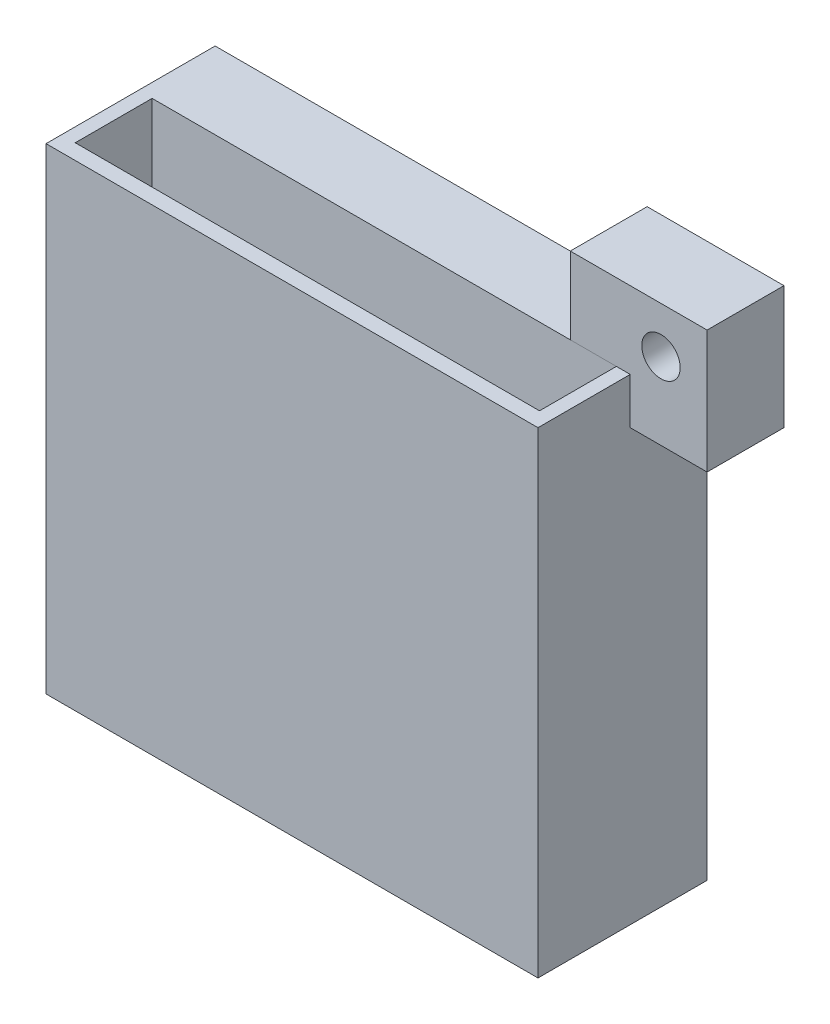
ISO-10303-21;
HEADER;
FILE_DESCRIPTION(('STEP AP214'),'2;1');
FILE_NAME('part.step','',(''),(''),'','','');
FILE_SCHEMA(('AUTOMOTIVE_DESIGN { 1 0 10303 214 1 1 1 1 }'));
ENDSEC;
DATA;
#1=APPLICATION_CONTEXT('core data for automotive mechanical design processes');
#2=APPLICATION_PROTOCOL_DEFINITION('international standard','automotive_design',2000,#1);
#3=PRODUCT_CONTEXT('',#1,'mechanical');
#4=PRODUCT('Part','Part','',(#3));
#5=PRODUCT_RELATED_PRODUCT_CATEGORY('part','',(#4));
#6=PRODUCT_DEFINITION_FORMATION('','',#4);
#7=PRODUCT_DEFINITION_CONTEXT('part definition',#1,'design');
#8=PRODUCT_DEFINITION('design','',#6,#7);
#9=PRODUCT_DEFINITION_SHAPE('','',#8);
#10=(LENGTH_UNIT() NAMED_UNIT(*) SI_UNIT(.MILLI.,.METRE.));
#11=(NAMED_UNIT(*) PLANE_ANGLE_UNIT() SI_UNIT($,.RADIAN.));
#12=(NAMED_UNIT(*) SI_UNIT($,.STERADIAN.) SOLID_ANGLE_UNIT());
#13=UNCERTAINTY_MEASURE_WITH_UNIT(LENGTH_MEASURE(1.E-05),#10,'distance_accuracy_value','');
#14=(GEOMETRIC_REPRESENTATION_CONTEXT(3) GLOBAL_UNCERTAINTY_ASSIGNED_CONTEXT((#13)) GLOBAL_UNIT_ASSIGNED_CONTEXT((#10,
#11,#12)) REPRESENTATION_CONTEXT('',''));
#15=CARTESIAN_POINT('',(0.,0.,0.));
#16=DIRECTION('',(0.,0.,1.));
#17=DIRECTION('',(1.,0.,0.));
#18=AXIS2_PLACEMENT_3D('',#15,#16,#17);
#19=CARTESIAN_POINT('',(33.1,0.,5.));
#20=DIRECTION('',(-1.,0.,0.));
#21=DIRECTION('',(0.,0.,1.));
#22=AXIS2_PLACEMENT_3D('',#19,#20,#21);
#23=PLANE('',#22);
#24=DIRECTION('',(0.,1.,0.));
#25=VECTOR('',#24,1.);
#26=CARTESIAN_POINT('',(33.1,0.,0.));
#27=LINE('',#26,#25);
#28=CARTESIAN_POINT('',(33.1,36.,0.));
#29=VERTEX_POINT('',#28);
#30=CARTESIAN_POINT('',(33.1,41.,0.));
#31=VERTEX_POINT('',#30);
#32=EDGE_CURVE('E126',#29,#31,#27,.T.);
#33=ORIENTED_EDGE('',*,*,#32,.F.);
#34=DIRECTION('',(0.,0.,-1.));
#35=VECTOR('',#34,1.);
#36=CARTESIAN_POINT('',(33.1,36.,5.));
#37=LINE('',#36,#35);
#38=CARTESIAN_POINT('',(33.1,36.,5.));
#39=VERTEX_POINT('',#38);
#40=EDGE_CURVE('E12',#39,#29,#37,.T.);
#41=ORIENTED_EDGE('',*,*,#40,.F.);
#42=DIRECTION('',(0.,1.,0.));
#43=VECTOR('',#42,1.);
#44=CARTESIAN_POINT('',(33.1,0.,5.));
#45=LINE('',#44,#43);
#46=CARTESIAN_POINT('',(33.1,41.,5.));
#47=VERTEX_POINT('',#46);
#48=EDGE_CURVE('E141',#39,#47,#45,.T.);
#49=ORIENTED_EDGE('',*,*,#48,.T.);
#50=DIRECTION('',(0.,0.,-1.));
#51=VECTOR('',#50,1.);
#52=CARTESIAN_POINT('',(33.1,41.,5.));
#53=LINE('',#52,#51);
#54=EDGE_CURVE('E61',#47,#31,#53,.T.);
#55=ORIENTED_EDGE('',*,*,#54,.T.);
#56=EDGE_LOOP('',(#33,#41,#49,#55));
#57=FACE_BOUND('',#56,.T.);
#58=ADVANCED_FACE('F45',(#57),#23,.T.);
#59=CARTESIAN_POINT('',(0.,36.,5.));
#60=DIRECTION('',(0.,1.,0.));
#61=DIRECTION('',(0.,0.,1.));
#62=AXIS2_PLACEMENT_3D('',#59,#60,#61);
#63=PLANE('',#62);
#64=DIRECTION('',(1.,0.,0.));
#65=VECTOR('',#64,1.);
#66=CARTESIAN_POINT('',(0.,36.,0.));
#67=LINE('',#66,#65);
#68=CARTESIAN_POINT('',(37.,36.,0.));
#69=VERTEX_POINT('',#68);
#70=EDGE_CURVE('E128',#29,#69,#67,.T.);
#71=ORIENTED_EDGE('',*,*,#70,.T.);
#72=DIRECTION('',(0.,0.,-1.));
#73=VECTOR('',#72,1.);
#74=CARTESIAN_POINT('',(37.,36.,5.));
#75=LINE('',#74,#73);
#76=CARTESIAN_POINT('',(37.,36.,5.));
#77=VERTEX_POINT('',#76);
#78=EDGE_CURVE('E53',#77,#69,#75,.T.);
#79=ORIENTED_EDGE('',*,*,#78,.F.);
#80=DIRECTION('',(1.,0.,0.));
#81=VECTOR('',#80,1.);
#82=CARTESIAN_POINT('',(0.,36.,5.));
#83=LINE('',#82,#81);
#84=EDGE_CURVE('E234',#39,#77,#83,.T.);
#85=ORIENTED_EDGE('',*,*,#84,.F.);
#86=ORIENTED_EDGE('',*,*,#40,.T.);
#87=EDGE_LOOP('',(#71,#79,#85,#86));
#88=FACE_BOUND('',#87,.T.);
#89=ADVANCED_FACE('F150',(#88),#63,.F.);
#90=CARTESIAN_POINT('',(37.,0.,5.));
#91=DIRECTION('',(-1.,0.,0.));
#92=DIRECTION('',(0.,0.,1.));
#93=AXIS2_PLACEMENT_3D('',#90,#91,#92);
#94=PLANE('',#93);
#95=DIRECTION('',(0.,1.,0.));
#96=VECTOR('',#95,1.);
#97=CARTESIAN_POINT('',(37.,0.,0.));
#98=LINE('',#97,#96);
#99=CARTESIAN_POINT('',(37.,33.,0.));
#100=VERTEX_POINT('',#99);
#101=EDGE_CURVE('E132',#100,#69,#98,.T.);
#102=ORIENTED_EDGE('',*,*,#101,.F.);
#103=DIRECTION('',(0.,0.,-1.));
#104=VECTOR('',#103,1.);
#105=CARTESIAN_POINT('',(37.,33.,5.));
#106=LINE('',#105,#104);
#107=CARTESIAN_POINT('',(37.,33.,5.));
#108=VERTEX_POINT('',#107);
#109=EDGE_CURVE('E118',#108,#100,#106,.T.);
#110=ORIENTED_EDGE('',*,*,#109,.F.);
#111=DIRECTION('',(0.,1.,0.));
#112=VECTOR('',#111,1.);
#113=CARTESIAN_POINT('',(37.,0.,5.));
#114=LINE('',#113,#112);
#115=EDGE_CURVE('E108',#108,#77,#114,.T.);
#116=ORIENTED_EDGE('',*,*,#115,.T.);
#117=ORIENTED_EDGE('',*,*,#78,.T.);
#118=EDGE_LOOP('',(#102,#110,#116,#117));
#119=FACE_BOUND('',#118,.T.);
#120=ADVANCED_FACE('F147',(#119),#94,.T.);
#121=CARTESIAN_POINT('',(0.,33.,5.));
#122=DIRECTION('',(0.,1.,0.));
#123=DIRECTION('',(0.,0.,1.));
#124=AXIS2_PLACEMENT_3D('',#121,#122,#123);
#125=PLANE('',#124);
#126=DIRECTION('',(1.,0.,0.));
#127=VECTOR('',#126,1.);
#128=CARTESIAN_POINT('',(0.,33.,0.));
#129=LINE('',#128,#127);
#130=CARTESIAN_POINT('',(42.,33.,0.));
#131=VERTEX_POINT('',#130);
#132=EDGE_CURVE('E115',#100,#131,#129,.T.);
#133=ORIENTED_EDGE('',*,*,#132,.T.);
#134=DIRECTION('',(0.,0.,-1.));
#135=VECTOR('',#134,1.);
#136=CARTESIAN_POINT('',(42.,33.,5.));
#137=LINE('',#136,#135);
#138=CARTESIAN_POINT('',(42.,33.,5.));
#139=VERTEX_POINT('',#138);
#140=EDGE_CURVE('E112',#139,#131,#137,.T.);
#141=ORIENTED_EDGE('',*,*,#140,.F.);
#142=DIRECTION('',(1.,0.,0.));
#143=VECTOR('',#142,1.);
#144=CARTESIAN_POINT('',(0.,33.,5.));
#145=LINE('',#144,#143);
#146=EDGE_CURVE('E100',#108,#139,#145,.T.);
#147=ORIENTED_EDGE('',*,*,#146,.F.);
#148=ORIENTED_EDGE('',*,*,#109,.T.);
#149=EDGE_LOOP('',(#133,#141,#147,#148));
#150=FACE_BOUND('',#149,.T.);
#151=ADVANCED_FACE('F113',(#150),#125,.F.);
#152=CARTESIAN_POINT('',(42.,0.,5.));
#153=DIRECTION('',(-1.,0.,0.));
#154=DIRECTION('',(0.,0.,1.));
#155=AXIS2_PLACEMENT_3D('',#152,#153,#154);
#156=PLANE('',#155);
#157=DIRECTION('',(0.,1.,0.));
#158=VECTOR('',#157,1.);
#159=CARTESIAN_POINT('',(42.,0.,0.));
#160=LINE('',#159,#158);
#161=CARTESIAN_POINT('',(42.,41.,0.));
#162=VERTEX_POINT('',#161);
#163=EDGE_CURVE('E136',#131,#162,#160,.T.);
#164=ORIENTED_EDGE('',*,*,#163,.T.);
#165=DIRECTION('',(0.,0.,-1.));
#166=VECTOR('',#165,1.);
#167=CARTESIAN_POINT('',(42.,41.,5.));
#168=LINE('',#167,#166);
#169=CARTESIAN_POINT('',(42.,41.,5.));
#170=VERTEX_POINT('',#169);
#171=EDGE_CURVE('E81',#170,#162,#168,.T.);
#172=ORIENTED_EDGE('',*,*,#171,.F.);
#173=DIRECTION('',(0.,1.,0.));
#174=VECTOR('',#173,1.);
#175=CARTESIAN_POINT('',(42.,0.,5.));
#176=LINE('',#175,#174);
#177=EDGE_CURVE('E106',#139,#170,#176,.T.);
#178=ORIENTED_EDGE('',*,*,#177,.F.);
#179=ORIENTED_EDGE('',*,*,#140,.T.);
#180=EDGE_LOOP('',(#164,#172,#178,#179));
#181=FACE_BOUND('',#180,.T.);
#182=ADVANCED_FACE('F120',(#181),#156,.F.);
#183=CARTESIAN_POINT('',(0.,41.,5.));
#184=DIRECTION('',(0.,1.,0.));
#185=DIRECTION('',(0.,0.,1.));
#186=AXIS2_PLACEMENT_3D('',#183,#184,#185);
#187=PLANE('',#186);
#188=DIRECTION('',(1.,0.,0.));
#189=VECTOR('',#188,1.);
#190=CARTESIAN_POINT('',(0.,41.,0.));
#191=LINE('',#190,#189);
#192=EDGE_CURVE('E138',#31,#162,#191,.T.);
#193=ORIENTED_EDGE('',*,*,#192,.F.);
#194=ORIENTED_EDGE('',*,*,#54,.F.);
#195=DIRECTION('',(1.,0.,0.));
#196=VECTOR('',#195,1.);
#197=CARTESIAN_POINT('',(0.,41.,5.));
#198=LINE('',#197,#196);
#199=EDGE_CURVE('E121',#47,#170,#198,.T.);
#200=ORIENTED_EDGE('',*,*,#199,.T.);
#201=ORIENTED_EDGE('',*,*,#171,.T.);
#202=EDGE_LOOP('',(#193,#194,#200,#201));
#203=FACE_BOUND('',#202,.T.);
#204=ADVANCED_FACE('F153',(#203),#187,.T.);
#205=CARTESIAN_POINT('',(0.,0.,5.));
#206=DIRECTION('',(0.,0.,1.));
#207=DIRECTION('',(1.,0.,0.));
#208=AXIS2_PLACEMENT_3D('',#205,#206,#207);
#209=PLANE('',#208);
#210=CARTESIAN_POINT('',(39.,38.,5.));
#211=DIRECTION('',(0.,0.,1.));
#212=DIRECTION('',(1.,0.,0.));
#213=AXIS2_PLACEMENT_3D('',#210,#211,#212);
#214=CIRCLE('',#213,1.25);
#215=CARTESIAN_POINT('',(40.25,38.,5.));
#216=VERTEX_POINT('',#215);
#217=EDGE_CURVE('E129',#216,#216,#214,.T.);
#218=ORIENTED_EDGE('',*,*,#217,.F.);
#219=EDGE_LOOP('',(#218));
#220=FACE_BOUND('',#219,.T.);
#221=ORIENTED_EDGE('',*,*,#48,.F.);
#222=ORIENTED_EDGE('',*,*,#84,.T.);
#223=ORIENTED_EDGE('',*,*,#115,.F.);
#224=ORIENTED_EDGE('',*,*,#146,.T.);
#225=ORIENTED_EDGE('',*,*,#177,.T.);
#226=ORIENTED_EDGE('',*,*,#199,.F.);
#227=EDGE_LOOP('',(#221,#222,#223,#224,#225,#226));
#228=FACE_BOUND('',#227,.T.);
#229=ADVANCED_FACE('F103',(#220,#228),#209,.T.);
#230=CARTESIAN_POINT('',(0.,0.,0.));
#231=DIRECTION('',(0.,0.,1.));
#232=DIRECTION('',(1.,0.,0.));
#233=AXIS2_PLACEMENT_3D('',#230,#231,#232);
#234=PLANE('',#233);
#235=ORIENTED_EDGE('',*,*,#32,.T.);
#236=ORIENTED_EDGE('',*,*,#192,.T.);
#237=ORIENTED_EDGE('',*,*,#163,.F.);
#238=ORIENTED_EDGE('',*,*,#132,.F.);
#239=ORIENTED_EDGE('',*,*,#101,.T.);
#240=ORIENTED_EDGE('',*,*,#70,.F.);
#241=EDGE_LOOP('',(#235,#236,#237,#238,#239,#240));
#242=FACE_BOUND('',#241,.T.);
#243=ADVANCED_FACE('F152',(#242),#234,.F.);
#244=CARTESIAN_POINT('',(39.,38.,5.));
#245=DIRECTION('',(0.,0.,1.));
#246=DIRECTION('',(1.,0.,0.));
#247=AXIS2_PLACEMENT_3D('',#244,#245,#246);
#248=CYLINDRICAL_SURFACE('',#247,1.25);
#249=CARTESIAN_POINT('',(39.,38.,2.));
#250=DIRECTION('',(0.,0.,1.));
#251=DIRECTION('',(1.,0.,0.));
#252=AXIS2_PLACEMENT_3D('',#249,#250,#251);
#253=CIRCLE('',#252,1.25);
#254=CARTESIAN_POINT('',(40.25,38.,2.));
#255=VERTEX_POINT('',#254);
#256=EDGE_CURVE('E228',#255,#255,#253,.T.);
#257=ORIENTED_EDGE('',*,*,#256,.F.);
#258=EDGE_LOOP('',(#257));
#259=FACE_BOUND('',#258,.T.);
#260=ORIENTED_EDGE('',*,*,#217,.T.);
#261=EDGE_LOOP('',(#260));
#262=FACE_BOUND('',#261,.T.);
#263=ADVANCED_FACE('F197',(#259,#262),#248,.F.);
#264=CARTESIAN_POINT('',(40.25,38.,2.));
#265=DIRECTION('',(0.,0.,-1.));
#266=DIRECTION('',(-1.,0.,0.));
#267=AXIS2_PLACEMENT_3D('',#264,#265,#266);
#268=PLANE('',#267);
#269=ORIENTED_EDGE('',*,*,#256,.T.);
#270=EDGE_LOOP('',(#269));
#271=FACE_BOUND('',#270,.T.);
#272=ADVANCED_FACE('F212',(#271),#268,.F.);
#273=CLOSED_SHELL('',(#58,#89,#120,#151,#182,#204,#229,#243,#263,#272));
#274=MANIFOLD_SOLID_BREP('B2',#273);
#275=CARTESIAN_POINT('',(36.1,0.,11.));
#276=DIRECTION('',(1.,0.,0.));
#277=DIRECTION('',(0.,0.,-1.));
#278=AXIS2_PLACEMENT_3D('',#275,#276,#277);
#279=PLANE('',#278);
#280=DIRECTION('',(0.,-1.,0.));
#281=VECTOR('',#280,1.);
#282=CARTESIAN_POINT('',(36.1,36.,10.));
#283=LINE('',#282,#281);
#284=CARTESIAN_POINT('',(36.1,36.,10.));
#285=VERTEX_POINT('',#284);
#286=CARTESIAN_POINT('',(36.1,6.,10.));
#287=VERTEX_POINT('',#286);
#288=EDGE_CURVE('E287',#285,#287,#283,.T.);
#289=ORIENTED_EDGE('',*,*,#288,.F.);
#290=DIRECTION('',(0.,0.,-1.));
#291=VECTOR('',#290,1.);
#292=CARTESIAN_POINT('',(36.1,36.,11.));
#293=LINE('',#292,#291);
#294=CARTESIAN_POINT('',(36.1,36.,5.));
#295=VERTEX_POINT('',#294);
#296=EDGE_CURVE('E449',#285,#295,#293,.T.);
#297=ORIENTED_EDGE('',*,*,#296,.T.);
#298=DIRECTION('',(0.,1.,0.));
#299=VECTOR('',#298,1.);
#300=CARTESIAN_POINT('',(36.1,0.,5.));
#301=LINE('',#300,#299);
#302=CARTESIAN_POINT('',(36.1,26.,5.));
#303=VERTEX_POINT('',#302);
#304=EDGE_CURVE('E396',#303,#295,#301,.T.);
#305=ORIENTED_EDGE('',*,*,#304,.F.);
#306=DIRECTION('',(0.,0.,-1.));
#307=VECTOR('',#306,1.);
#308=CARTESIAN_POINT('',(36.1,26.,5.));
#309=LINE('',#308,#307);
#310=CARTESIAN_POINT('',(36.1,26.,0.));
#311=VERTEX_POINT('',#310);
#312=EDGE_CURVE('E408',#303,#311,#309,.T.);
#313=ORIENTED_EDGE('',*,*,#312,.T.);
#314=DIRECTION('',(0.,-1.,0.));
#315=VECTOR('',#314,1.);
#316=CARTESIAN_POINT('',(36.1,0.,0.));
#317=LINE('',#316,#315);
#318=CARTESIAN_POINT('',(36.1,6.,0.));
#319=VERTEX_POINT('',#318);
#320=EDGE_CURVE('E432',#311,#319,#317,.T.);
#321=ORIENTED_EDGE('',*,*,#320,.T.);
#322=DIRECTION('',(0.,0.,-1.));
#323=VECTOR('',#322,1.);
#324=CARTESIAN_POINT('',(36.1,6.,11.));
#325=LINE('',#324,#323);
#326=EDGE_CURVE('E447',#287,#319,#325,.T.);
#327=ORIENTED_EDGE('',*,*,#326,.F.);
#328=EDGE_LOOP('',(#289,#297,#305,#313,#321,#327));
#329=FACE_BOUND('',#328,.T.);
#330=ADVANCED_FACE('F272',(#329),#279,.F.);
#331=CARTESIAN_POINT('',(5.9,0.,11.));
#332=DIRECTION('',(1.,0.,0.));
#333=DIRECTION('',(0.,1.,0.));
#334=AXIS2_PLACEMENT_3D('',#331,#332,#333);
#335=PLANE('',#334);
#336=DIRECTION('',(0.,0.,-1.));
#337=VECTOR('',#336,1.);
#338=CARTESIAN_POINT('',(5.9,36.,11.));
#339=LINE('',#338,#337);
#340=CARTESIAN_POINT('',(5.9,36.,10.));
#341=VERTEX_POINT('',#340);
#342=CARTESIAN_POINT('',(5.9,36.,5.));
#343=VERTEX_POINT('',#342);
#344=EDGE_CURVE('E295',#341,#343,#339,.T.);
#345=ORIENTED_EDGE('',*,*,#344,.F.);
#346=DIRECTION('',(0.,-1.,0.));
#347=VECTOR('',#346,1.);
#348=CARTESIAN_POINT('',(5.9,36.,10.));
#349=LINE('',#348,#347);
#350=CARTESIAN_POINT('',(5.9,6.,10.));
#351=VERTEX_POINT('',#350);
#352=EDGE_CURVE('E580',#341,#351,#349,.T.);
#353=ORIENTED_EDGE('',*,*,#352,.T.);
#354=DIRECTION('',(0.,0.,-1.));
#355=VECTOR('',#354,1.);
#356=CARTESIAN_POINT('',(5.9,6.,11.));
#357=LINE('',#356,#355);
#358=CARTESIAN_POINT('',(5.9,6.,0.));
#359=VERTEX_POINT('',#358);
#360=EDGE_CURVE('E386',#351,#359,#357,.T.);
#361=ORIENTED_EDGE('',*,*,#360,.T.);
#362=DIRECTION('',(0.,-1.,0.));
#363=VECTOR('',#362,1.);
#364=CARTESIAN_POINT('',(5.9,0.,0.));
#365=LINE('',#364,#363);
#366=CARTESIAN_POINT('',(5.9,26.,0.));
#367=VERTEX_POINT('',#366);
#368=EDGE_CURVE('E438',#367,#359,#365,.T.);
#369=ORIENTED_EDGE('',*,*,#368,.F.);
#370=DIRECTION('',(0.,0.,-1.));
#371=VECTOR('',#370,1.);
#372=CARTESIAN_POINT('',(5.9,26.,5.));
#373=LINE('',#372,#371);
#374=CARTESIAN_POINT('',(5.9,26.,5.));
#375=VERTEX_POINT('',#374);
#376=EDGE_CURVE('E401',#375,#367,#373,.T.);
#377=ORIENTED_EDGE('',*,*,#376,.F.);
#378=DIRECTION('',(0.,1.,0.));
#379=VECTOR('',#378,1.);
#380=CARTESIAN_POINT('',(5.9,0.,5.));
#381=LINE('',#380,#379);
#382=EDGE_CURVE('E394',#375,#343,#381,.T.);
#383=ORIENTED_EDGE('',*,*,#382,.T.);
#384=EDGE_LOOP('',(#345,#353,#361,#369,#377,#383));
#385=FACE_BOUND('',#384,.T.);
#386=ADVANCED_FACE('F399',(#385),#335,.T.);
#387=CARTESIAN_POINT('',(0.,6.,11.));
#388=DIRECTION('',(0.,1.,0.));
#389=DIRECTION('',(0.,0.,1.));
#390=AXIS2_PLACEMENT_3D('',#387,#388,#389);
#391=PLANE('',#390);
#392=ORIENTED_EDGE('',*,*,#360,.F.);
#393=DIRECTION('',(-1.,0.,0.));
#394=VECTOR('',#393,1.);
#395=CARTESIAN_POINT('',(5.9,6.,10.));
#396=LINE('',#395,#394);
#397=EDGE_CURVE('E576',#287,#351,#396,.T.);
#398=ORIENTED_EDGE('',*,*,#397,.F.);
#399=ORIENTED_EDGE('',*,*,#326,.T.);
#400=DIRECTION('',(1.,0.,0.));
#401=VECTOR('',#400,1.);
#402=CARTESIAN_POINT('',(0.,6.,0.));
#403=LINE('',#402,#401);
#404=EDGE_CURVE('E435',#359,#319,#403,.T.);
#405=ORIENTED_EDGE('',*,*,#404,.F.);
#406=EDGE_LOOP('',(#392,#398,#399,#405));
#407=FACE_BOUND('',#406,.T.);
#408=ADVANCED_FACE('F541',(#407),#391,.T.);
#409=CARTESIAN_POINT('',(0.,7.99841719249848,5.));
#410=DIRECTION('',(0.,-1.,0.));
#411=DIRECTION('',(0.,0.,-1.));
#412=AXIS2_PLACEMENT_3D('',#409,#410,#411);
#413=PLANE('',#412);
#414=DIRECTION('',(-1.,0.,0.));
#415=VECTOR('',#414,1.);
#416=CARTESIAN_POINT('',(0.,7.99841719249848,0.));
#417=LINE('',#416,#415);
#418=CARTESIAN_POINT('',(5.,7.99841719249848,0.));
#419=VERTEX_POINT('',#418);
#420=CARTESIAN_POINT('',(0.,7.99841719249848,0.));
#421=VERTEX_POINT('',#420);
#422=EDGE_CURVE('E457',#419,#421,#417,.T.);
#423=ORIENTED_EDGE('',*,*,#422,.T.);
#424=DIRECTION('',(0.,0.,-1.));
#425=VECTOR('',#424,1.);
#426=CARTESIAN_POINT('',(0.,7.99841719249848,5.));
#427=LINE('',#426,#425);
#428=CARTESIAN_POINT('',(0.,7.99841719249848,5.));
#429=VERTEX_POINT('',#428);
#430=EDGE_CURVE('E280',#429,#421,#427,.T.);
#431=ORIENTED_EDGE('',*,*,#430,.F.);
#432=DIRECTION('',(-1.,0.,0.));
#433=VECTOR('',#432,1.);
#434=CARTESIAN_POINT('',(0.,7.99841719249848,5.));
#435=LINE('',#434,#433);
#436=CARTESIAN_POINT('',(5.,7.99841719249848,5.));
#437=VERTEX_POINT('',#436);
#438=EDGE_CURVE('E460',#437,#429,#435,.T.);
#439=ORIENTED_EDGE('',*,*,#438,.F.);
#440=DIRECTION('',(0.,0.,-1.));
#441=VECTOR('',#440,1.);
#442=CARTESIAN_POINT('',(5.,7.99841719249848,5.));
#443=LINE('',#442,#441);
#444=EDGE_CURVE('E43',#437,#419,#443,.T.);
#445=ORIENTED_EDGE('',*,*,#444,.T.);
#446=EDGE_LOOP('',(#423,#431,#439,#445));
#447=FACE_BOUND('',#446,.T.);
#448=ADVANCED_FACE('F274',(#447),#413,.F.);
#449=CARTESIAN_POINT('',(0.,0.,5.));
#450=DIRECTION('',(-1.,0.,0.));
#451=DIRECTION('',(0.,0.,1.));
#452=AXIS2_PLACEMENT_3D('',#449,#450,#451);
#453=PLANE('',#452);
#454=DIRECTION('',(0.,1.,0.));
#455=VECTOR('',#454,1.);
#456=CARTESIAN_POINT('',(0.,0.,0.));
#457=LINE('',#456,#455);
#458=CARTESIAN_POINT('',(0.,0.,0.));
#459=VERTEX_POINT('',#458);
#460=EDGE_CURVE('E476',#459,#421,#457,.T.);
#461=ORIENTED_EDGE('',*,*,#460,.F.);
#462=DIRECTION('',(0.,0.,-1.));
#463=VECTOR('',#462,1.);
#464=CARTESIAN_POINT('',(0.,0.,5.));
#465=LINE('',#464,#463);
#466=CARTESIAN_POINT('',(0.,0.,5.));
#467=VERTEX_POINT('',#466);
#468=EDGE_CURVE('E487',#467,#459,#465,.T.);
#469=ORIENTED_EDGE('',*,*,#468,.F.);
#470=DIRECTION('',(0.,1.,0.));
#471=VECTOR('',#470,1.);
#472=CARTESIAN_POINT('',(0.,0.,5.));
#473=LINE('',#472,#471);
#474=EDGE_CURVE('E463',#467,#429,#473,.T.);
#475=ORIENTED_EDGE('',*,*,#474,.T.);
#476=ORIENTED_EDGE('',*,*,#430,.T.);
#477=EDGE_LOOP('',(#461,#469,#475,#476));
#478=FACE_BOUND('',#477,.T.);
#479=ADVANCED_FACE('F491',(#478),#453,.T.);
#480=CARTESIAN_POINT('',(0.,0.,5.));
#481=DIRECTION('',(0.,1.,0.));
#482=DIRECTION('',(0.,0.,1.));
#483=AXIS2_PLACEMENT_3D('',#480,#481,#482);
#484=PLANE('',#483);
#485=DIRECTION('',(1.,0.,0.));
#486=VECTOR('',#485,1.);
#487=CARTESIAN_POINT('',(0.,0.,0.));
#488=LINE('',#487,#486);
#489=CARTESIAN_POINT('',(8.,0.,0.));
#490=VERTEX_POINT('',#489);
#491=EDGE_CURVE('E479',#459,#490,#488,.T.);
#492=ORIENTED_EDGE('',*,*,#491,.T.);
#493=DIRECTION('',(0.,0.,-1.));
#494=VECTOR('',#493,1.);
#495=CARTESIAN_POINT('',(8.,0.,5.));
#496=LINE('',#495,#494);
#497=CARTESIAN_POINT('',(8.,0.,5.));
#498=VERTEX_POINT('',#497);
#499=EDGE_CURVE('E485',#498,#490,#496,.T.);
#500=ORIENTED_EDGE('',*,*,#499,.F.);
#501=DIRECTION('',(1.,0.,0.));
#502=VECTOR('',#501,1.);
#503=CARTESIAN_POINT('',(0.,0.,5.));
#504=LINE('',#503,#502);
#505=EDGE_CURVE('E466',#467,#498,#504,.T.);
#506=ORIENTED_EDGE('',*,*,#505,.F.);
#507=ORIENTED_EDGE('',*,*,#468,.T.);
#508=EDGE_LOOP('',(#492,#500,#506,#507));
#509=FACE_BOUND('',#508,.T.);
#510=ADVANCED_FACE('F504',(#509),#484,.F.);
#511=CARTESIAN_POINT('',(8.,0.,5.));
#512=DIRECTION('',(1.,0.,0.));
#513=DIRECTION('',(0.,0.,-1.));
#514=AXIS2_PLACEMENT_3D('',#511,#512,#513);
#515=PLANE('',#514);
#516=DIRECTION('',(0.,-1.,0.));
#517=VECTOR('',#516,1.);
#518=CARTESIAN_POINT('',(8.,0.,0.));
#519=LINE('',#518,#517);
#520=CARTESIAN_POINT('',(8.,4.99841719249848,0.));
#521=VERTEX_POINT('',#520);
#522=EDGE_CURVE('E461',#521,#490,#519,.T.);
#523=ORIENTED_EDGE('',*,*,#522,.F.);
#524=DIRECTION('',(0.,0.,-1.));
#525=VECTOR('',#524,1.);
#526=CARTESIAN_POINT('',(8.,4.99841719249848,5.));
#527=LINE('',#526,#525);
#528=CARTESIAN_POINT('',(8.,4.99841719249848,5.));
#529=VERTEX_POINT('',#528);
#530=EDGE_CURVE('E473',#529,#521,#527,.T.);
#531=ORIENTED_EDGE('',*,*,#530,.F.);
#532=DIRECTION('',(0.,-1.,0.));
#533=VECTOR('',#532,1.);
#534=CARTESIAN_POINT('',(8.,0.,5.));
#535=LINE('',#534,#533);
#536=EDGE_CURVE('E468',#529,#498,#535,.T.);
#537=ORIENTED_EDGE('',*,*,#536,.T.);
#538=ORIENTED_EDGE('',*,*,#499,.T.);
#539=EDGE_LOOP('',(#523,#531,#537,#538));
#540=FACE_BOUND('',#539,.T.);
#541=ADVANCED_FACE('F593',(#540),#515,.T.);
#542=CARTESIAN_POINT('',(0.,0.,5.));
#543=DIRECTION('',(0.,0.,1.));
#544=DIRECTION('',(1.,0.,0.));
#545=AXIS2_PLACEMENT_3D('',#542,#543,#544);
#546=PLANE('',#545);
#547=CARTESIAN_POINT('',(3.,3.,5.));
#548=DIRECTION('',(0.,0.,1.));
#549=DIRECTION('',(1.,0.,0.));
#550=AXIS2_PLACEMENT_3D('',#547,#548,#549);
#551=CIRCLE('',#550,1.25);
#552=CARTESIAN_POINT('',(4.25,3.,5.));
#553=VERTEX_POINT('',#552);
#554=EDGE_CURVE('E573',#553,#553,#551,.T.);
#555=ORIENTED_EDGE('',*,*,#554,.F.);
#556=EDGE_LOOP('',(#555));
#557=FACE_BOUND('',#556,.T.);
#558=DIRECTION('',(0.,-1.,0.));
#559=VECTOR('',#558,1.);
#560=CARTESIAN_POINT('',(5.00000000000001,0.,5.));
#561=LINE('',#560,#559);
#562=CARTESIAN_POINT('',(5.,4.99841719249848,5.));
#563=VERTEX_POINT('',#562);
#564=EDGE_CURVE('E458',#437,#563,#561,.T.);
#565=ORIENTED_EDGE('',*,*,#564,.F.);
#566=ORIENTED_EDGE('',*,*,#438,.T.);
#567=ORIENTED_EDGE('',*,*,#474,.F.);
#568=ORIENTED_EDGE('',*,*,#505,.T.);
#569=ORIENTED_EDGE('',*,*,#536,.F.);
#570=DIRECTION('',(1.,0.,0.));
#571=VECTOR('',#570,1.);
#572=CARTESIAN_POINT('',(0.,4.99841719249848,5.));
#573=LINE('',#572,#571);
#574=EDGE_CURVE('E471',#563,#529,#573,.T.);
#575=ORIENTED_EDGE('',*,*,#574,.F.);
#576=EDGE_LOOP('',(#565,#566,#567,#568,#569,#575));
#577=FACE_BOUND('',#576,.T.);
#578=ADVANCED_FACE('F509',(#557,#577),#546,.T.);
#579=CARTESIAN_POINT('',(0.,0.,0.));
#580=DIRECTION('',(0.,0.,1.));
#581=DIRECTION('',(1.,0.,0.));
#582=AXIS2_PLACEMENT_3D('',#579,#580,#581);
#583=PLANE('',#582);
#584=ORIENTED_EDGE('',*,*,#320,.F.);
#585=DIRECTION('',(1.,0.,0.));
#586=VECTOR('',#585,1.);
#587=CARTESIAN_POINT('',(0.,26.,0.));
#588=LINE('',#587,#586);
#589=EDGE_CURVE('E397',#367,#311,#588,.T.);
#590=ORIENTED_EDGE('',*,*,#589,.F.);
#591=ORIENTED_EDGE('',*,*,#368,.T.);
#592=ORIENTED_EDGE('',*,*,#404,.T.);
#593=EDGE_LOOP('',(#584,#590,#591,#592));
#594=FACE_BOUND('',#593,.T.);
#595=DIRECTION('',(1.,0.,0.));
#596=VECTOR('',#595,1.);
#597=CARTESIAN_POINT('',(0.,4.99841719249848,0.));
#598=LINE('',#597,#596);
#599=CARTESIAN_POINT('',(37.,4.99841719249848,0.));
#600=VERTEX_POINT('',#599);
#601=EDGE_CURVE('E414',#521,#600,#598,.T.);
#602=ORIENTED_EDGE('',*,*,#601,.F.);
#603=ORIENTED_EDGE('',*,*,#522,.T.);
#604=ORIENTED_EDGE('',*,*,#491,.F.);
#605=ORIENTED_EDGE('',*,*,#460,.T.);
#606=ORIENTED_EDGE('',*,*,#422,.F.);
#607=DIRECTION('',(0.,-1.,0.));
#608=VECTOR('',#607,1.);
#609=CARTESIAN_POINT('',(5.00000000000001,0.,0.));
#610=LINE('',#609,#608);
#611=CARTESIAN_POINT('',(5.,36.,0.));
#612=VERTEX_POINT('',#611);
#613=EDGE_CURVE('E419',#612,#419,#610,.T.);
#614=ORIENTED_EDGE('',*,*,#613,.F.);
#615=DIRECTION('',(-1.,0.,0.));
#616=VECTOR('',#615,1.);
#617=CARTESIAN_POINT('',(0.,36.,0.));
#618=LINE('',#617,#616);
#619=CARTESIAN_POINT('',(37.,36.,0.));
#620=VERTEX_POINT('',#619);
#621=EDGE_CURVE('E430',#620,#612,#618,.T.);
#622=ORIENTED_EDGE('',*,*,#621,.F.);
#623=DIRECTION('',(0.,1.,0.));
#624=VECTOR('',#623,1.);
#625=CARTESIAN_POINT('',(37.,0.,0.));
#626=LINE('',#625,#624);
#627=EDGE_CURVE('E428',#600,#620,#626,.T.);
#628=ORIENTED_EDGE('',*,*,#627,.F.);
#629=EDGE_LOOP('',(#602,#603,#604,#605,#606,#614,#622,#628));
#630=FACE_BOUND('',#629,.T.);
#631=ADVANCED_FACE('F500',(#594,#630),#583,.F.);
#632=CARTESIAN_POINT('',(5.00000000000001,0.,11.));
#633=DIRECTION('',(1.,0.,0.));
#634=DIRECTION('',(0.,1.,0.));
#635=AXIS2_PLACEMENT_3D('',#632,#633,#634);
#636=PLANE('',#635);
#637=ORIENTED_EDGE('',*,*,#613,.T.);
#638=ORIENTED_EDGE('',*,*,#444,.F.);
#639=ORIENTED_EDGE('',*,*,#564,.T.);
#640=DIRECTION('',(0.,0.,-1.));
#641=VECTOR('',#640,1.);
#642=CARTESIAN_POINT('',(5.,4.99841719249848,11.));
#643=LINE('',#642,#641);
#644=CARTESIAN_POINT('',(5.,4.99841719249848,11.));
#645=VERTEX_POINT('',#644);
#646=EDGE_CURVE('E426',#645,#563,#643,.T.);
#647=ORIENTED_EDGE('',*,*,#646,.F.);
#648=DIRECTION('',(0.,-1.,0.));
#649=VECTOR('',#648,1.);
#650=CARTESIAN_POINT('',(5.00000000000001,0.,11.));
#651=LINE('',#650,#649);
#652=CARTESIAN_POINT('',(5.,36.,11.));
#653=VERTEX_POINT('',#652);
#654=EDGE_CURVE('E424',#653,#645,#651,.T.);
#655=ORIENTED_EDGE('',*,*,#654,.F.);
#656=DIRECTION('',(0.,0.,-1.));
#657=VECTOR('',#656,1.);
#658=CARTESIAN_POINT('',(5.,36.,11.));
#659=LINE('',#658,#657);
#660=EDGE_CURVE('E387',#653,#612,#659,.T.);
#661=ORIENTED_EDGE('',*,*,#660,.T.);
#662=EDGE_LOOP('',(#637,#638,#639,#647,#655,#661));
#663=FACE_BOUND('',#662,.T.);
#664=ADVANCED_FACE('F513',(#663),#636,.F.);
#665=CARTESIAN_POINT('',(0.,4.99841719249848,11.));
#666=DIRECTION('',(0.,1.,0.));
#667=DIRECTION('',(0.,0.,1.));
#668=AXIS2_PLACEMENT_3D('',#665,#666,#667);
#669=PLANE('',#668);
#670=ORIENTED_EDGE('',*,*,#530,.T.);
#671=ORIENTED_EDGE('',*,*,#601,.T.);
#672=DIRECTION('',(0.,0.,-1.));
#673=VECTOR('',#672,1.);
#674=CARTESIAN_POINT('',(37.,4.99841719249848,11.));
#675=LINE('',#674,#673);
#676=CARTESIAN_POINT('',(37.,4.99841719249848,11.));
#677=VERTEX_POINT('',#676);
#678=EDGE_CURVE('E454',#677,#600,#675,.T.);
#679=ORIENTED_EDGE('',*,*,#678,.F.);
#680=DIRECTION('',(1.,0.,0.));
#681=VECTOR('',#680,1.);
#682=CARTESIAN_POINT('',(0.,4.99841719249848,11.));
#683=LINE('',#682,#681);
#684=EDGE_CURVE('E415',#645,#677,#683,.T.);
#685=ORIENTED_EDGE('',*,*,#684,.F.);
#686=ORIENTED_EDGE('',*,*,#646,.T.);
#687=ORIENTED_EDGE('',*,*,#574,.T.);
#688=EDGE_LOOP('',(#670,#671,#679,#685,#686,#687));
#689=FACE_BOUND('',#688,.T.);
#690=ADVANCED_FACE('F517',(#689),#669,.F.);
#691=CARTESIAN_POINT('',(37.,0.,11.));
#692=DIRECTION('',(-1.,0.,0.));
#693=DIRECTION('',(0.,0.,1.));
#694=AXIS2_PLACEMENT_3D('',#691,#692,#693);
#695=PLANE('',#694);
#696=ORIENTED_EDGE('',*,*,#627,.T.);
#697=DIRECTION('',(0.,0.,-1.));
#698=VECTOR('',#697,1.);
#699=CARTESIAN_POINT('',(37.,36.,11.));
#700=LINE('',#699,#698);
#701=CARTESIAN_POINT('',(37.,36.,11.));
#702=VERTEX_POINT('',#701);
#703=EDGE_CURVE('E451',#702,#620,#700,.T.);
#704=ORIENTED_EDGE('',*,*,#703,.F.);
#705=DIRECTION('',(0.,1.,0.));
#706=VECTOR('',#705,1.);
#707=CARTESIAN_POINT('',(37.,0.,11.));
#708=LINE('',#707,#706);
#709=EDGE_CURVE('E418',#677,#702,#708,.T.);
#710=ORIENTED_EDGE('',*,*,#709,.F.);
#711=ORIENTED_EDGE('',*,*,#678,.T.);
#712=EDGE_LOOP('',(#696,#704,#710,#711));
#713=FACE_BOUND('',#712,.T.);
#714=ADVANCED_FACE('F527',(#713),#695,.F.);
#715=CARTESIAN_POINT('',(0.,36.,11.));
#716=DIRECTION('',(0.,-1.,0.));
#717=DIRECTION('',(0.,0.,-1.));
#718=AXIS2_PLACEMENT_3D('',#715,#716,#717);
#719=PLANE('',#718);
#720=ORIENTED_EDGE('',*,*,#296,.F.);
#721=DIRECTION('',(-1.,0.,0.));
#722=VECTOR('',#721,1.);
#723=CARTESIAN_POINT('',(5.9,36.,10.));
#724=LINE('',#723,#722);
#725=EDGE_CURVE('E384',#285,#341,#724,.T.);
#726=ORIENTED_EDGE('',*,*,#725,.T.);
#727=ORIENTED_EDGE('',*,*,#344,.T.);
#728=DIRECTION('',(1.,0.,0.));
#729=VECTOR('',#728,1.);
#730=CARTESIAN_POINT('',(0.,36.,5.));
#731=LINE('',#730,#729);
#732=EDGE_CURVE('E382',#343,#295,#731,.T.);
#733=ORIENTED_EDGE('',*,*,#732,.T.);
#734=EDGE_LOOP('',(#720,#726,#727,#733));
#735=FACE_BOUND('',#734,.T.);
#736=ORIENTED_EDGE('',*,*,#621,.T.);
#737=ORIENTED_EDGE('',*,*,#660,.F.);
#738=DIRECTION('',(1.,0.,0.));
#739=VECTOR('',#738,1.);
#740=CARTESIAN_POINT('',(0.,36.,11.));
#741=LINE('',#740,#739);
#742=EDGE_CURVE('E422',#653,#702,#741,.T.);
#743=ORIENTED_EDGE('',*,*,#742,.T.);
#744=ORIENTED_EDGE('',*,*,#703,.T.);
#745=EDGE_LOOP('',(#736,#737,#743,#744));
#746=FACE_BOUND('',#745,.T.);
#747=ADVANCED_FACE('F380',(#735,#746),#719,.F.);
#748=CARTESIAN_POINT('',(0.,0.,11.));
#749=DIRECTION('',(0.,0.,1.));
#750=DIRECTION('',(1.,0.,0.));
#751=AXIS2_PLACEMENT_3D('',#748,#749,#750);
#752=PLANE('',#751);
#753=ORIENTED_EDGE('',*,*,#684,.T.);
#754=ORIENTED_EDGE('',*,*,#709,.T.);
#755=ORIENTED_EDGE('',*,*,#742,.F.);
#756=ORIENTED_EDGE('',*,*,#654,.T.);
#757=EDGE_LOOP('',(#753,#754,#755,#756));
#758=FACE_BOUND('',#757,.T.);
#759=ADVANCED_FACE('F521',(#758),#752,.T.);
#760=CARTESIAN_POINT('',(0.,26.,5.));
#761=DIRECTION('',(0.,1.,0.));
#762=DIRECTION('',(0.,0.,1.));
#763=AXIS2_PLACEMENT_3D('',#760,#761,#762);
#764=PLANE('',#763);
#765=ORIENTED_EDGE('',*,*,#589,.T.);
#766=ORIENTED_EDGE('',*,*,#312,.F.);
#767=DIRECTION('',(1.,0.,0.));
#768=VECTOR('',#767,1.);
#769=CARTESIAN_POINT('',(0.,26.,5.));
#770=LINE('',#769,#768);
#771=EDGE_CURVE('E402',#375,#303,#770,.T.);
#772=ORIENTED_EDGE('',*,*,#771,.F.);
#773=ORIENTED_EDGE('',*,*,#376,.T.);
#774=EDGE_LOOP('',(#765,#766,#772,#773));
#775=FACE_BOUND('',#774,.T.);
#776=ADVANCED_FACE('F551',(#775),#764,.F.);
#777=CARTESIAN_POINT('',(0.,0.,5.));
#778=DIRECTION('',(0.,0.,1.));
#779=DIRECTION('',(1.,0.,0.));
#780=AXIS2_PLACEMENT_3D('',#777,#778,#779);
#781=PLANE('',#780);
#782=ORIENTED_EDGE('',*,*,#732,.F.);
#783=ORIENTED_EDGE('',*,*,#382,.F.);
#784=ORIENTED_EDGE('',*,*,#771,.T.);
#785=ORIENTED_EDGE('',*,*,#304,.T.);
#786=EDGE_LOOP('',(#782,#783,#784,#785));
#787=FACE_BOUND('',#786,.T.);
#788=ADVANCED_FACE('F392',(#787),#781,.T.);
#789=CARTESIAN_POINT('',(5.9,36.,10.));
#790=DIRECTION('',(0.,0.,1.));
#791=DIRECTION('',(1.,0.,0.));
#792=AXIS2_PLACEMENT_3D('',#789,#790,#791);
#793=PLANE('',#792);
#794=ORIENTED_EDGE('',*,*,#397,.T.);
#795=ORIENTED_EDGE('',*,*,#352,.F.);
#796=ORIENTED_EDGE('',*,*,#725,.F.);
#797=ORIENTED_EDGE('',*,*,#288,.T.);
#798=EDGE_LOOP('',(#794,#795,#796,#797));
#799=FACE_BOUND('',#798,.T.);
#800=ADVANCED_FACE('F557',(#799),#793,.F.);
#801=CARTESIAN_POINT('',(3.,3.,5.));
#802=DIRECTION('',(0.,0.,1.));
#803=DIRECTION('',(1.,0.,0.));
#804=AXIS2_PLACEMENT_3D('',#801,#802,#803);
#805=CYLINDRICAL_SURFACE('',#804,1.25);
#806=CARTESIAN_POINT('',(3.,3.,2.));
#807=DIRECTION('',(0.,0.,1.));
#808=DIRECTION('',(1.,0.,0.));
#809=AXIS2_PLACEMENT_3D('',#806,#807,#808);
#810=CIRCLE('',#809,1.25);
#811=CARTESIAN_POINT('',(4.25,3.,2.));
#812=VERTEX_POINT('',#811);
#813=EDGE_CURVE('E572',#812,#812,#810,.T.);
#814=ORIENTED_EDGE('',*,*,#813,.F.);
#815=EDGE_LOOP('',(#814));
#816=FACE_BOUND('',#815,.T.);
#817=ORIENTED_EDGE('',*,*,#554,.T.);
#818=EDGE_LOOP('',(#817));
#819=FACE_BOUND('',#818,.T.);
#820=ADVANCED_FACE('F560',(#816,#819),#805,.F.);
#821=CARTESIAN_POINT('',(4.25,3.,2.));
#822=DIRECTION('',(0.,0.,-1.));
#823=DIRECTION('',(-1.,0.,0.));
#824=AXIS2_PLACEMENT_3D('',#821,#822,#823);
#825=PLANE('',#824);
#826=ORIENTED_EDGE('',*,*,#813,.T.);
#827=EDGE_LOOP('',(#826));
#828=FACE_BOUND('',#827,.T.);
#829=ADVANCED_FACE('F564',(#828),#825,.F.);
#830=CLOSED_SHELL('',(#330,#386,#408,#448,#479,#510,#541,#578,#631,#664,#690,#714,#747,#759,
#776,#788,#800,#820,#829));
#831=MANIFOLD_SOLID_BREP('B6',#830);
#832=ADVANCED_BREP_SHAPE_REPRESENTATION('',(#18,#274,#831),#14);
#833=SHAPE_DEFINITION_REPRESENTATION(#9,#832);
ENDSEC;
END-ISO-10303-21;
